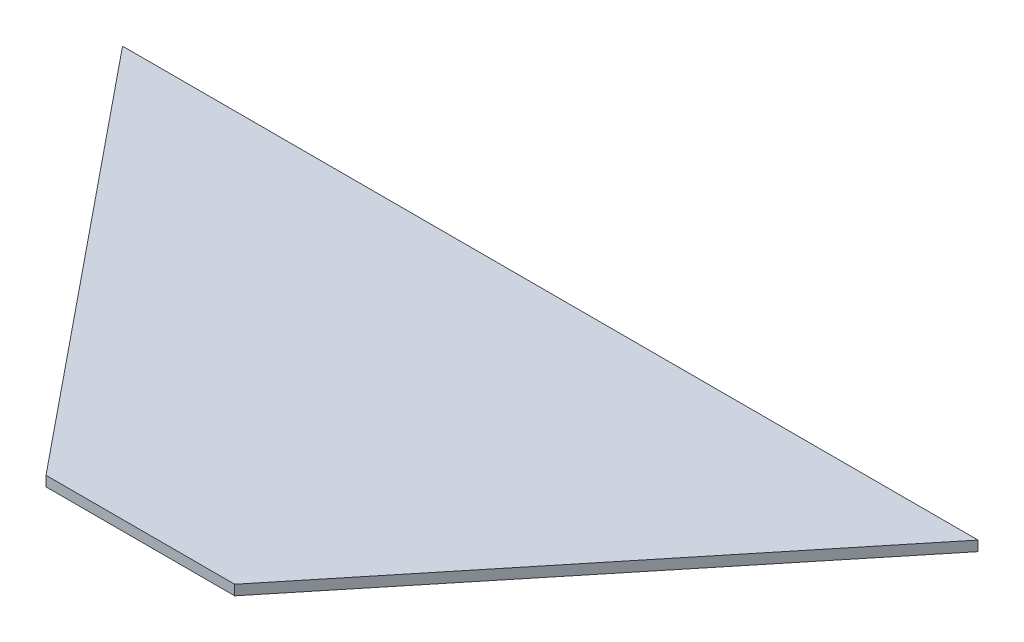
ISO-10303-21;
HEADER;
FILE_DESCRIPTION(('STEP AP214'),'2;1');
FILE_NAME('part.step','',(''),(''),'','','');
FILE_SCHEMA(('AUTOMOTIVE_DESIGN { 1 0 10303 214 1 1 1 1 }'));
ENDSEC;
DATA;
#1=APPLICATION_CONTEXT('core data for automotive mechanical design processes');
#2=APPLICATION_PROTOCOL_DEFINITION('international standard','automotive_design',2000,#1);
#3=PRODUCT_CONTEXT('',#1,'mechanical');
#4=PRODUCT('Part','Part','',(#3));
#5=PRODUCT_RELATED_PRODUCT_CATEGORY('part','',(#4));
#6=PRODUCT_DEFINITION_FORMATION('','',#4);
#7=PRODUCT_DEFINITION_CONTEXT('part definition',#1,'design');
#8=PRODUCT_DEFINITION('design','',#6,#7);
#9=PRODUCT_DEFINITION_SHAPE('','',#8);
#10=(LENGTH_UNIT() NAMED_UNIT(*) SI_UNIT(.MILLI.,.METRE.));
#11=(NAMED_UNIT(*) PLANE_ANGLE_UNIT() SI_UNIT($,.RADIAN.));
#12=(NAMED_UNIT(*) SI_UNIT($,.STERADIAN.) SOLID_ANGLE_UNIT());
#13=UNCERTAINTY_MEASURE_WITH_UNIT(LENGTH_MEASURE(1.E-05),#10,'distance_accuracy_value','');
#14=(GEOMETRIC_REPRESENTATION_CONTEXT(3) GLOBAL_UNCERTAINTY_ASSIGNED_CONTEXT((#13)) GLOBAL_UNIT_ASSIGNED_CONTEXT((#10,
#11,#12)) REPRESENTATION_CONTEXT('',''));
#15=CARTESIAN_POINT('',(0.,0.,0.));
#16=DIRECTION('',(0.,0.,1.));
#17=DIRECTION('',(1.,0.,0.));
#18=AXIS2_PLACEMENT_3D('',#15,#16,#17);
#19=CARTESIAN_POINT('',(0.,13.9999999999999,0.));
#20=DIRECTION('',(0.,-1.,0.));
#21=DIRECTION('',(0.,0.,-1.));
#22=AXIS2_PLACEMENT_3D('',#19,#20,#21);
#23=PLANE('',#22);
#24=DIRECTION('',(-1.,0.,0.));
#25=VECTOR('',#24,1.);
#26=CARTESIAN_POINT('',(90.0840298358614,13.9999999999999,385.251864546256));
#27=LINE('',#26,#25);
#28=CARTESIAN_POINT('',(90.0840298358614,13.9999999999999,385.251864546256));
#29=VERTEX_POINT('',#28);
#30=CARTESIAN_POINT('',(15.0840298358614,13.9999999999999,385.251864546256));
#31=VERTEX_POINT('',#30);
#32=EDGE_CURVE('E66',#29,#31,#27,.T.);
#33=ORIENTED_EDGE('',*,*,#32,.F.);
#34=DIRECTION('',(-0.630952380952381,0.,0.775821560006244));
#35=VECTOR('',#34,1.);
#36=CARTESIAN_POINT('',(222.584029835861,13.9999999999999,222.329336944945));
#37=LINE('',#36,#35);
#38=CARTESIAN_POINT('',(222.584029835861,13.9999999999999,222.329336944945));
#39=VERTEX_POINT('',#38);
#40=EDGE_CURVE('E74',#39,#29,#37,.T.);
#41=ORIENTED_EDGE('',*,*,#40,.F.);
#42=DIRECTION('',(1.,0.,0.));
#43=VECTOR('',#42,1.);
#44=CARTESIAN_POINT('',(-117.415970164139,13.9999999999999,222.329336944945));
#45=LINE('',#44,#43);
#46=CARTESIAN_POINT('',(-117.415970164139,13.9999999999999,222.329336944945));
#47=VERTEX_POINT('',#46);
#48=EDGE_CURVE('E81',#47,#39,#45,.T.);
#49=ORIENTED_EDGE('',*,*,#48,.F.);
#50=DIRECTION('',(-0.630952380952381,0.,-0.775821560006244));
#51=VECTOR('',#50,1.);
#52=CARTESIAN_POINT('',(15.0840298358614,13.9999999999999,385.251864546256));
#53=LINE('',#52,#51);
#54=EDGE_CURVE('E45',#31,#47,#53,.T.);
#55=ORIENTED_EDGE('',*,*,#54,.F.);
#56=EDGE_LOOP('',(#33,#41,#49,#55));
#57=FACE_BOUND('',#56,.T.);
#58=ADVANCED_FACE('F36',(#57),#23,.F.);
#59=CARTESIAN_POINT('',(0.,9.99999999999988,0.));
#60=DIRECTION('',(0.,-1.,0.));
#61=DIRECTION('',(0.,0.,-1.));
#62=AXIS2_PLACEMENT_3D('',#59,#60,#61);
#63=PLANE('',#62);
#64=DIRECTION('',(-1.,0.,0.));
#65=VECTOR('',#64,1.);
#66=CARTESIAN_POINT('',(90.0840298358614,9.9999999999999,385.251864546256));
#67=LINE('',#66,#65);
#68=CARTESIAN_POINT('',(90.0840298358614,9.9999999999999,385.251864546256));
#69=VERTEX_POINT('',#68);
#70=CARTESIAN_POINT('',(15.0840298358614,9.99999999999991,385.251864546256));
#71=VERTEX_POINT('',#70);
#72=EDGE_CURVE('E123',#69,#71,#67,.T.);
#73=ORIENTED_EDGE('',*,*,#72,.T.);
#74=DIRECTION('',(-0.630952380952381,0.,-0.775821560006244));
#75=VECTOR('',#74,1.);
#76=CARTESIAN_POINT('',(15.0840298358614,9.99999999999991,385.251864546256));
#77=LINE('',#76,#75);
#78=CARTESIAN_POINT('',(-117.415970164139,9.99999999999987,222.329336944945));
#79=VERTEX_POINT('',#78);
#80=EDGE_CURVE('E12',#71,#79,#77,.T.);
#81=ORIENTED_EDGE('',*,*,#80,.T.);
#82=DIRECTION('',(1.,0.,0.));
#83=VECTOR('',#82,1.);
#84=CARTESIAN_POINT('',(-117.415970164139,9.99999999999987,222.329336944945));
#85=LINE('',#84,#83);
#86=CARTESIAN_POINT('',(222.584029835861,9.99999999999987,222.329336944945));
#87=VERTEX_POINT('',#86);
#88=EDGE_CURVE('E96',#79,#87,#85,.T.);
#89=ORIENTED_EDGE('',*,*,#88,.T.);
#90=DIRECTION('',(-0.630952380952381,0.,0.775821560006244));
#91=VECTOR('',#90,1.);
#92=CARTESIAN_POINT('',(222.584029835861,9.99999999999987,222.329336944945));
#93=LINE('',#92,#91);
#94=EDGE_CURVE('E87',#87,#69,#93,.T.);
#95=ORIENTED_EDGE('',*,*,#94,.T.);
#96=EDGE_LOOP('',(#73,#81,#89,#95));
#97=FACE_BOUND('',#96,.T.);
#98=ADVANCED_FACE('F98',(#97),#63,.T.);
#99=CARTESIAN_POINT('',(90.0840298358614,9.9999999999999,385.251864546256));
#100=DIRECTION('',(0.,0.,-1.));
#101=DIRECTION('',(-1.,0.,0.));
#102=AXIS2_PLACEMENT_3D('',#99,#100,#101);
#103=PLANE('',#102);
#104=ORIENTED_EDGE('',*,*,#32,.T.);
#105=DIRECTION('',(0.,1.,0.));
#106=VECTOR('',#105,1.);
#107=CARTESIAN_POINT('',(15.0840298358614,9.99999999999991,385.251864546256));
#108=LINE('',#107,#106);
#109=EDGE_CURVE('E121',#71,#31,#108,.T.);
#110=ORIENTED_EDGE('',*,*,#109,.F.);
#111=ORIENTED_EDGE('',*,*,#72,.F.);
#112=DIRECTION('',(0.,1.,0.));
#113=VECTOR('',#112,1.);
#114=CARTESIAN_POINT('',(90.0840298358614,9.9999999999999,385.251864546256));
#115=LINE('',#114,#113);
#116=EDGE_CURVE('E90',#69,#29,#115,.T.);
#117=ORIENTED_EDGE('',*,*,#116,.T.);
#118=EDGE_LOOP('',(#104,#110,#111,#117));
#119=FACE_BOUND('',#118,.T.);
#120=ADVANCED_FACE('F138',(#119),#103,.F.);
#121=CARTESIAN_POINT('',(222.584029835861,9.99999999999987,222.329336944945));
#122=DIRECTION('',(-0.775821560006244,0.,-0.630952380952381));
#123=DIRECTION('',(-0.630952380952381,0.,0.775821560006244));
#124=AXIS2_PLACEMENT_3D('',#121,#122,#123);
#125=PLANE('',#124);
#126=ORIENTED_EDGE('',*,*,#40,.T.);
#127=ORIENTED_EDGE('',*,*,#116,.F.);
#128=ORIENTED_EDGE('',*,*,#94,.F.);
#129=DIRECTION('',(0.,1.,0.));
#130=VECTOR('',#129,1.);
#131=CARTESIAN_POINT('',(222.584029835861,9.99999999999987,222.329336944945));
#132=LINE('',#131,#130);
#133=EDGE_CURVE('E89',#87,#39,#132,.T.);
#134=ORIENTED_EDGE('',*,*,#133,.T.);
#135=EDGE_LOOP('',(#126,#127,#128,#134));
#136=FACE_BOUND('',#135,.T.);
#137=ADVANCED_FACE('F88',(#136),#125,.F.);
#138=CARTESIAN_POINT('',(-117.415970164139,9.99999999999987,222.329336944945));
#139=DIRECTION('',(0.,0.,1.));
#140=DIRECTION('',(1.,0.,0.));
#141=AXIS2_PLACEMENT_3D('',#138,#139,#140);
#142=PLANE('',#141);
#143=ORIENTED_EDGE('',*,*,#48,.T.);
#144=ORIENTED_EDGE('',*,*,#133,.F.);
#145=ORIENTED_EDGE('',*,*,#88,.F.);
#146=DIRECTION('',(0.,1.,0.));
#147=VECTOR('',#146,1.);
#148=CARTESIAN_POINT('',(-117.415970164139,9.99999999999987,222.329336944945));
#149=LINE('',#148,#147);
#150=EDGE_CURVE('E99',#79,#47,#149,.T.);
#151=ORIENTED_EDGE('',*,*,#150,.T.);
#152=EDGE_LOOP('',(#143,#144,#145,#151));
#153=FACE_BOUND('',#152,.T.);
#154=ADVANCED_FACE('F95',(#153),#142,.F.);
#155=CARTESIAN_POINT('',(15.0840298358614,9.99999999999991,385.251864546256));
#156=DIRECTION('',(0.775821560006244,0.,-0.630952380952381));
#157=DIRECTION('',(-0.630952380952381,0.,-0.775821560006244));
#158=AXIS2_PLACEMENT_3D('',#155,#156,#157);
#159=PLANE('',#158);
#160=ORIENTED_EDGE('',*,*,#54,.T.);
#161=ORIENTED_EDGE('',*,*,#150,.F.);
#162=ORIENTED_EDGE('',*,*,#80,.F.);
#163=ORIENTED_EDGE('',*,*,#109,.T.);
#164=EDGE_LOOP('',(#160,#161,#162,#163));
#165=FACE_BOUND('',#164,.T.);
#166=ADVANCED_FACE('F132',(#165),#159,.F.);
#167=CLOSED_SHELL('',(#58,#98,#120,#137,#154,#166));
#168=MANIFOLD_SOLID_BREP('B2',#167);
#169=ADVANCED_BREP_SHAPE_REPRESENTATION('',(#18,#168),#14);
#170=SHAPE_DEFINITION_REPRESENTATION(#9,#169);
ENDSEC;
END-ISO-10303-21;
